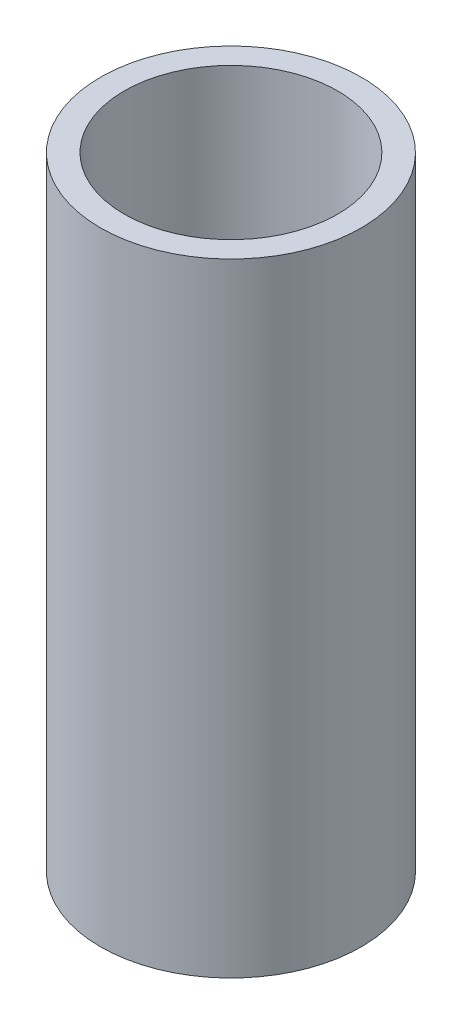
ISO-10303-21;
HEADER;
FILE_DESCRIPTION(('STEP AP214'),'2;1');
FILE_NAME('part.step','',(''),(''),'','','');
FILE_SCHEMA(('AUTOMOTIVE_DESIGN { 1 0 10303 214 1 1 1 1 }'));
ENDSEC;
DATA;
#1=APPLICATION_CONTEXT('core data for automotive mechanical design processes');
#2=APPLICATION_PROTOCOL_DEFINITION('international standard','automotive_design',2000,#1);
#3=PRODUCT_CONTEXT('',#1,'mechanical');
#4=PRODUCT('Part','Part','',(#3));
#5=PRODUCT_RELATED_PRODUCT_CATEGORY('part','',(#4));
#6=PRODUCT_DEFINITION_FORMATION('','',#4);
#7=PRODUCT_DEFINITION_CONTEXT('part definition',#1,'design');
#8=PRODUCT_DEFINITION('design','',#6,#7);
#9=PRODUCT_DEFINITION_SHAPE('','',#8);
#10=(LENGTH_UNIT() NAMED_UNIT(*) SI_UNIT(.MILLI.,.METRE.));
#11=(NAMED_UNIT(*) PLANE_ANGLE_UNIT() SI_UNIT($,.RADIAN.));
#12=(NAMED_UNIT(*) SI_UNIT($,.STERADIAN.) SOLID_ANGLE_UNIT());
#13=UNCERTAINTY_MEASURE_WITH_UNIT(LENGTH_MEASURE(1.E-05),#10,'distance_accuracy_value','');
#14=(GEOMETRIC_REPRESENTATION_CONTEXT(3) GLOBAL_UNCERTAINTY_ASSIGNED_CONTEXT((#13)) GLOBAL_UNIT_ASSIGNED_CONTEXT((#10,
#11,#12)) REPRESENTATION_CONTEXT('',''));
#15=CARTESIAN_POINT('',(0.,0.,0.));
#16=DIRECTION('',(0.,0.,1.));
#17=DIRECTION('',(1.,0.,0.));
#18=AXIS2_PLACEMENT_3D('',#15,#16,#17);
#19=CARTESIAN_POINT('',(0.,10.,0.));
#20=DIRECTION('',(0.,1.,0.));
#21=DIRECTION('',(0.,0.,1.));
#22=AXIS2_PLACEMENT_3D('',#19,#20,#21);
#23=PLANE('',#22);
#24=CARTESIAN_POINT('',(0.,10.,0.));
#25=DIRECTION('',(0.,1.,0.));
#26=DIRECTION('',(0.,0.,1.));
#27=AXIS2_PLACEMENT_3D('',#24,#25,#26);
#28=CIRCLE('',#27,2.0955);
#29=CARTESIAN_POINT('',(0.,10.,2.0955));
#30=VERTEX_POINT('',#29);
#31=EDGE_CURVE('E10',#30,#30,#28,.T.);
#32=ORIENTED_EDGE('',*,*,#31,.T.);
#33=EDGE_LOOP('',(#32));
#34=FACE_BOUND('',#33,.T.);
#35=CARTESIAN_POINT('',(0.,10.,0.));
#36=DIRECTION('',(0.,1.,0.));
#37=DIRECTION('',(0.,0.,1.));
#38=AXIS2_PLACEMENT_3D('',#35,#36,#37);
#39=CIRCLE('',#38,1.7145);
#40=CARTESIAN_POINT('',(0.,10.,1.7145));
#41=VERTEX_POINT('',#40);
#42=EDGE_CURVE('E42',#41,#41,#39,.T.);
#43=ORIENTED_EDGE('',*,*,#42,.F.);
#44=EDGE_LOOP('',(#43));
#45=FACE_BOUND('',#44,.T.);
#46=ADVANCED_FACE('F31',(#34,#45),#23,.T.);
#47=CARTESIAN_POINT('',(0.,0.,0.));
#48=DIRECTION('',(0.,1.,0.));
#49=DIRECTION('',(0.,0.,1.));
#50=AXIS2_PLACEMENT_3D('',#47,#48,#49);
#51=PLANE('',#50);
#52=CARTESIAN_POINT('',(0.,0.,0.));
#53=DIRECTION('',(0.,1.,0.));
#54=DIRECTION('',(0.,0.,1.));
#55=AXIS2_PLACEMENT_3D('',#52,#53,#54);
#56=CIRCLE('',#55,2.0955);
#57=CARTESIAN_POINT('',(0.,0.,2.0955));
#58=VERTEX_POINT('',#57);
#59=EDGE_CURVE('E35',#58,#58,#56,.T.);
#60=ORIENTED_EDGE('',*,*,#59,.F.);
#61=EDGE_LOOP('',(#60));
#62=FACE_BOUND('',#61,.T.);
#63=CARTESIAN_POINT('',(0.,0.,0.));
#64=DIRECTION('',(0.,1.,0.));
#65=DIRECTION('',(0.,0.,1.));
#66=AXIS2_PLACEMENT_3D('',#63,#64,#65);
#67=CIRCLE('',#66,1.7145);
#68=CARTESIAN_POINT('',(0.,0.,1.7145));
#69=VERTEX_POINT('',#68);
#70=EDGE_CURVE('E44',#69,#69,#67,.T.);
#71=ORIENTED_EDGE('',*,*,#70,.T.);
#72=EDGE_LOOP('',(#71));
#73=FACE_BOUND('',#72,.T.);
#74=ADVANCED_FACE('F54',(#62,#73),#51,.F.);
#75=CARTESIAN_POINT('',(0.,10.,0.));
#76=DIRECTION('',(0.,-1.,0.));
#77=DIRECTION('',(0.,0.,-1.));
#78=AXIS2_PLACEMENT_3D('',#75,#76,#77);
#79=CYLINDRICAL_SURFACE('',#78,2.0955);
#80=ORIENTED_EDGE('',*,*,#31,.F.);
#81=EDGE_LOOP('',(#80));
#82=FACE_BOUND('',#81,.T.);
#83=ORIENTED_EDGE('',*,*,#59,.T.);
#84=EDGE_LOOP('',(#83));
#85=FACE_BOUND('',#84,.T.);
#86=ADVANCED_FACE('F33',(#82,#85),#79,.T.);
#87=CARTESIAN_POINT('',(0.,10.,0.));
#88=DIRECTION('',(0.,-1.,0.));
#89=DIRECTION('',(0.,0.,-1.));
#90=AXIS2_PLACEMENT_3D('',#87,#88,#89);
#91=CYLINDRICAL_SURFACE('',#90,1.7145);
#92=ORIENTED_EDGE('',*,*,#42,.T.);
#93=EDGE_LOOP('',(#92));
#94=FACE_BOUND('',#93,.T.);
#95=ORIENTED_EDGE('',*,*,#70,.F.);
#96=EDGE_LOOP('',(#95));
#97=FACE_BOUND('',#96,.T.);
#98=ADVANCED_FACE('F50',(#94,#97),#91,.F.);
#99=CLOSED_SHELL('',(#46,#74,#86,#98));
#100=MANIFOLD_SOLID_BREP('B2',#99);
#101=ADVANCED_BREP_SHAPE_REPRESENTATION('',(#18,#100),#14);
#102=SHAPE_DEFINITION_REPRESENTATION(#9,#101);
ENDSEC;
END-ISO-10303-21;
